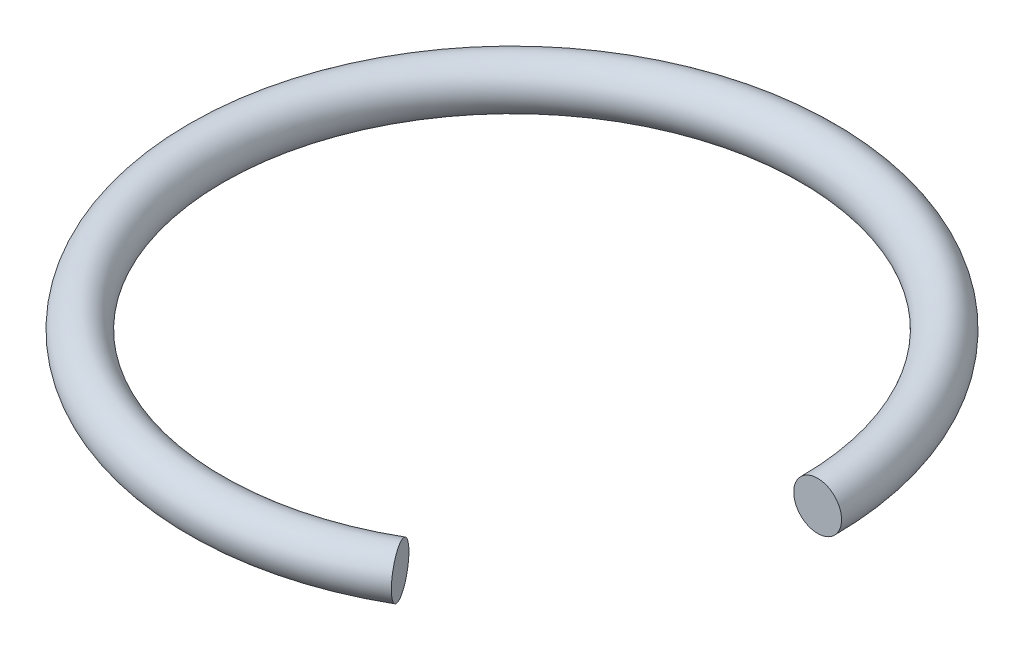
ISO-10303-21;
HEADER;
FILE_DESCRIPTION(('STEP AP214'),'2;1');
FILE_NAME('part.step','',(''),(''),'','','');
FILE_SCHEMA(('AUTOMOTIVE_DESIGN { 1 0 10303 214 1 1 1 1 }'));
ENDSEC;
DATA;
#1=APPLICATION_CONTEXT('core data for automotive mechanical design processes');
#2=APPLICATION_PROTOCOL_DEFINITION('international standard','automotive_design',2000,#1);
#3=PRODUCT_CONTEXT('',#1,'mechanical');
#4=PRODUCT('Part','Part','',(#3));
#5=PRODUCT_RELATED_PRODUCT_CATEGORY('part','',(#4));
#6=PRODUCT_DEFINITION_FORMATION('','',#4);
#7=PRODUCT_DEFINITION_CONTEXT('part definition',#1,'design');
#8=PRODUCT_DEFINITION('design','',#6,#7);
#9=PRODUCT_DEFINITION_SHAPE('','',#8);
#10=(LENGTH_UNIT() NAMED_UNIT(*) SI_UNIT(.MILLI.,.METRE.));
#11=(NAMED_UNIT(*) PLANE_ANGLE_UNIT() SI_UNIT($,.RADIAN.));
#12=(NAMED_UNIT(*) SI_UNIT($,.STERADIAN.) SOLID_ANGLE_UNIT());
#13=UNCERTAINTY_MEASURE_WITH_UNIT(LENGTH_MEASURE(1.E-05),#10,'distance_accuracy_value','');
#14=(GEOMETRIC_REPRESENTATION_CONTEXT(3) GLOBAL_UNCERTAINTY_ASSIGNED_CONTEXT((#13)) GLOBAL_UNIT_ASSIGNED_CONTEXT((#10,
#11,#12)) REPRESENTATION_CONTEXT('',''));
#15=CARTESIAN_POINT('',(0.,0.,0.));
#16=DIRECTION('',(0.,0.,1.));
#17=DIRECTION('',(1.,0.,0.));
#18=AXIS2_PLACEMENT_3D('',#15,#16,#17);
#19=CARTESIAN_POINT('',(0.,0.,0.));
#20=DIRECTION('',(0.,-1.,0.));
#21=DIRECTION('',(0.,0.,-1.));
#22=AXIS2_PLACEMENT_3D('',#19,#20,#21);
#23=TOROIDAL_SURFACE('',#22,2.3,0.18);
#24=CARTESIAN_POINT('',(1.15,0.,1.99185842870421));
#25=DIRECTION('',(-0.866025403784439,0.,0.5));
#26=DIRECTION('',(0.5,0.,0.866025403784439));
#27=AXIS2_PLACEMENT_3D('',#24,#25,#26);
#28=CIRCLE('',#27,0.18);
#29=CARTESIAN_POINT('',(1.24,0.,2.14774300138541));
#30=VERTEX_POINT('',#29);
#31=EDGE_CURVE('E10',#30,#30,#28,.T.);
#32=CARTESIAN_POINT('',(2.3,0.,0.));
#33=DIRECTION('',(0.,0.,1.));
#34=DIRECTION('',(1.,0.,0.));
#35=AXIS2_PLACEMENT_3D('',#32,#33,#34);
#36=CIRCLE('',#35,0.18);
#37=CARTESIAN_POINT('',(2.48,0.,0.));
#38=VERTEX_POINT('',#37);
#39=EDGE_CURVE('E41',#38,#38,#36,.T.);
#40=CARTESIAN_POINT('',(0.,0.,0.));
#41=DIRECTION('',(0.,-1.,0.));
#42=DIRECTION('',(0.,0.,-1.));
#43=AXIS2_PLACEMENT_3D('',#40,#41,#42);
#44=CIRCLE('',#43,2.48);
#45=EDGE_CURVE('',#30,#38,#44,.T.);
#46=ORIENTED_EDGE('',*,*,#31,.T.);
#47=ORIENTED_EDGE('',*,*,#39,.F.);
#48=ORIENTED_EDGE('',*,*,#45,.T.);
#49=ORIENTED_EDGE('',*,*,#45,.F.);
#50=EDGE_LOOP('',(#46,#48,#47,#49));
#51=FACE_BOUND('',#50,.T.);
#52=ADVANCED_FACE('F35',(#51),#23,.T.);
#53=CARTESIAN_POINT('',(1.15,0.,1.99185842870421));
#54=DIRECTION('',(-0.866025403784439,0.,0.5));
#55=DIRECTION('',(0.5,0.,0.866025403784439));
#56=AXIS2_PLACEMENT_3D('',#53,#54,#55);
#57=PLANE('',#56);
#58=ORIENTED_EDGE('',*,*,#31,.F.);
#59=EDGE_LOOP('',(#58));
#60=FACE_BOUND('',#59,.T.);
#61=ADVANCED_FACE('F50',(#60),#57,.F.);
#62=CARTESIAN_POINT('',(2.3,0.,0.));
#63=DIRECTION('',(0.,0.,1.));
#64=DIRECTION('',(1.,0.,0.));
#65=AXIS2_PLACEMENT_3D('',#62,#63,#64);
#66=PLANE('',#65);
#67=ORIENTED_EDGE('',*,*,#39,.T.);
#68=EDGE_LOOP('',(#67));
#69=FACE_BOUND('',#68,.T.);
#70=ADVANCED_FACE('F47',(#69),#66,.T.);
#71=CLOSED_SHELL('',(#52,#61,#70));
#72=MANIFOLD_SOLID_BREP('B2',#71);
#73=ADVANCED_BREP_SHAPE_REPRESENTATION('',(#18,#72),#14);
#74=SHAPE_DEFINITION_REPRESENTATION(#9,#73);
ENDSEC;
END-ISO-10303-21;
